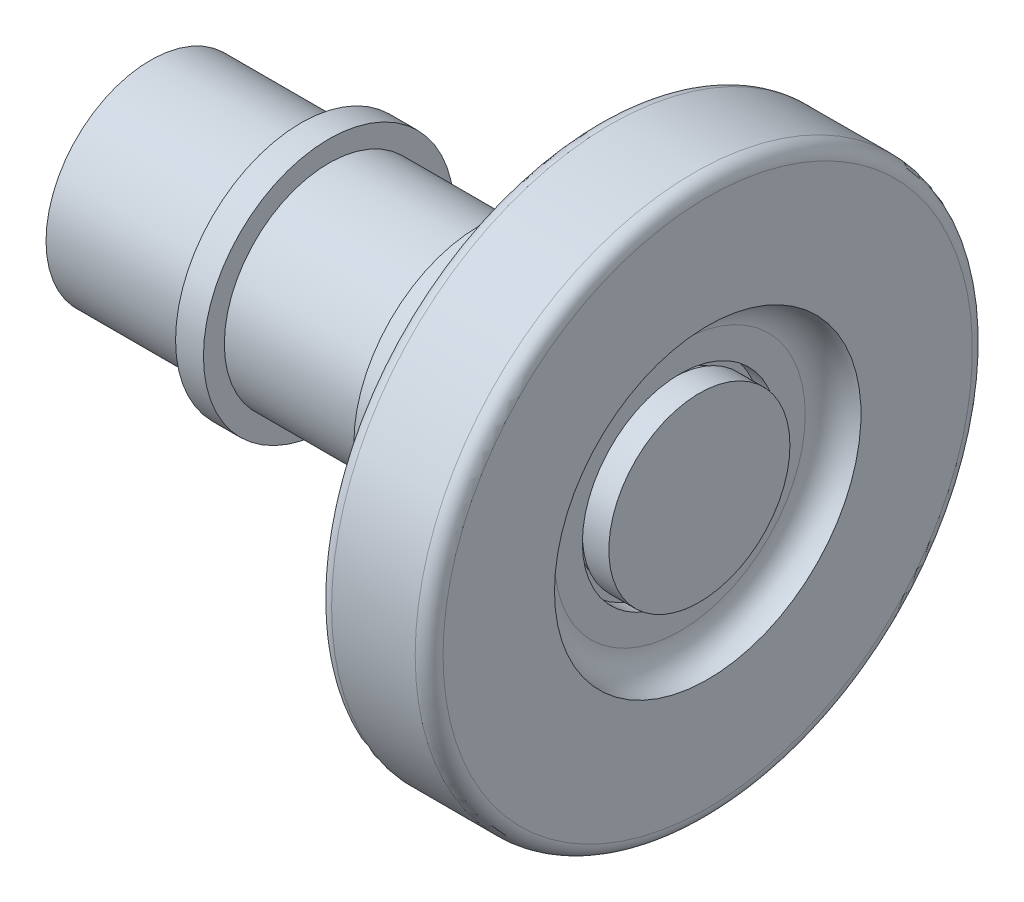
ISO-10303-21;
HEADER;
FILE_DESCRIPTION(('STEP AP214'),'2;1');
FILE_NAME('part.step','',(''),(''),'','','');
FILE_SCHEMA(('AUTOMOTIVE_DESIGN { 1 0 10303 214 1 1 1 1 }'));
ENDSEC;
DATA;
#1=APPLICATION_CONTEXT('core data for automotive mechanical design processes');
#2=APPLICATION_PROTOCOL_DEFINITION('international standard','automotive_design',2000,#1);
#3=PRODUCT_CONTEXT('',#1,'mechanical');
#4=PRODUCT('Part','Part','',(#3));
#5=PRODUCT_RELATED_PRODUCT_CATEGORY('part','',(#4));
#6=PRODUCT_DEFINITION_FORMATION('','',#4);
#7=PRODUCT_DEFINITION_CONTEXT('part definition',#1,'design');
#8=PRODUCT_DEFINITION('design','',#6,#7);
#9=PRODUCT_DEFINITION_SHAPE('','',#8);
#10=(LENGTH_UNIT() NAMED_UNIT(*) SI_UNIT(.MILLI.,.METRE.));
#11=(NAMED_UNIT(*) PLANE_ANGLE_UNIT() SI_UNIT($,.RADIAN.));
#12=(NAMED_UNIT(*) SI_UNIT($,.STERADIAN.) SOLID_ANGLE_UNIT());
#13=UNCERTAINTY_MEASURE_WITH_UNIT(LENGTH_MEASURE(1.E-05),#10,'distance_accuracy_value','');
#14=(GEOMETRIC_REPRESENTATION_CONTEXT(3) GLOBAL_UNCERTAINTY_ASSIGNED_CONTEXT((#13)) GLOBAL_UNIT_ASSIGNED_CONTEXT((#10,
#11,#12)) REPRESENTATION_CONTEXT('',''));
#15=CARTESIAN_POINT('',(0.,0.,0.));
#16=DIRECTION('',(0.,0.,1.));
#17=DIRECTION('',(1.,0.,0.));
#18=AXIS2_PLACEMENT_3D('',#15,#16,#17);
#19=CARTESIAN_POINT('',(34.,0.,0.));
#20=DIRECTION('',(-1.,0.,0.));
#21=DIRECTION('',(0.,0.,1.));
#22=AXIS2_PLACEMENT_3D('',#19,#20,#21);
#23=PLANE('',#22);
#24=CARTESIAN_POINT('',(34.,0.,0.));
#25=DIRECTION('',(-1.,0.,0.));
#26=DIRECTION('',(0.,0.,1.));
#27=AXIS2_PLACEMENT_3D('',#24,#25,#26);
#28=CIRCLE('',#27,35.);
#29=CARTESIAN_POINT('',(34.,0.,35.));
#30=VERTEX_POINT('',#29);
#31=EDGE_CURVE('E43',#30,#30,#28,.F.);
#32=ORIENTED_EDGE('',*,*,#31,.T.);
#33=EDGE_LOOP('',(#32));
#34=FACE_BOUND('',#33,.T.);
#35=CARTESIAN_POINT('',(34.,0.,0.));
#36=DIRECTION('',(-1.,0.,0.));
#37=DIRECTION('',(0.,0.,1.));
#38=AXIS2_PLACEMENT_3D('',#35,#36,#37);
#39=CIRCLE('',#38,31.);
#40=CARTESIAN_POINT('',(34.,0.,31.));
#41=VERTEX_POINT('',#40);
#42=EDGE_CURVE('E10',#41,#41,#39,.F.);
#43=ORIENTED_EDGE('',*,*,#42,.F.);
#44=EDGE_LOOP('',(#43));
#45=FACE_BOUND('',#44,.T.);
#46=ADVANCED_FACE('F32',(#34,#45),#23,.F.);
#47=CARTESIAN_POINT('',(-96.,0.,0.));
#48=DIRECTION('',(-1.,0.,0.));
#49=DIRECTION('',(0.,0.,1.));
#50=AXIS2_PLACEMENT_3D('',#47,#48,#49);
#51=PLANE('',#50);
#52=CARTESIAN_POINT('',(-96.,0.,0.));
#53=DIRECTION('',(-1.,0.,0.));
#54=DIRECTION('',(0.,0.,1.));
#55=AXIS2_PLACEMENT_3D('',#52,#53,#54);
#56=CIRCLE('',#55,45.);
#57=CARTESIAN_POINT('',(-96.,0.,45.));
#58=VERTEX_POINT('',#57);
#59=EDGE_CURVE('E86',#58,#58,#56,.T.);
#60=ORIENTED_EDGE('',*,*,#59,.T.);
#61=EDGE_LOOP('',(#60));
#62=FACE_BOUND('',#61,.T.);
#63=CARTESIAN_POINT('',(-96.,0.,0.));
#64=DIRECTION('',(-1.,0.,0.));
#65=DIRECTION('',(0.,0.,1.));
#66=AXIS2_PLACEMENT_3D('',#63,#64,#65);
#67=CIRCLE('',#66,37.5);
#68=CARTESIAN_POINT('',(-96.,0.,37.5));
#69=VERTEX_POINT('',#68);
#70=EDGE_CURVE('E95',#69,#69,#67,.T.);
#71=ORIENTED_EDGE('',*,*,#70,.F.);
#72=EDGE_LOOP('',(#71));
#73=FACE_BOUND('',#72,.T.);
#74=ADVANCED_FACE('F135',(#62,#73),#51,.T.);
#75=CARTESIAN_POINT('',(-32.,0.,0.));
#76=DIRECTION('',(-1.,0.,0.));
#77=DIRECTION('',(0.,0.,1.));
#78=AXIS2_PLACEMENT_3D('',#75,#76,#77);
#79=PLANE('',#78);
#80=CARTESIAN_POINT('',(-32.,0.,0.));
#81=DIRECTION('',(-1.,0.,0.));
#82=DIRECTION('',(0.,0.,1.));
#83=AXIS2_PLACEMENT_3D('',#80,#81,#82);
#84=CIRCLE('',#83,45.);
#85=CARTESIAN_POINT('',(-32.,0.,45.));
#86=VERTEX_POINT('',#85);
#87=EDGE_CURVE('E79',#86,#86,#84,.T.);
#88=ORIENTED_EDGE('',*,*,#87,.T.);
#89=EDGE_LOOP('',(#88));
#90=FACE_BOUND('',#89,.T.);
#91=CARTESIAN_POINT('',(-32.,0.,0.));
#92=DIRECTION('',(-1.,0.,0.));
#93=DIRECTION('',(0.,0.,1.));
#94=AXIS2_PLACEMENT_3D('',#91,#92,#93);
#95=CIRCLE('',#94,37.5);
#96=CARTESIAN_POINT('',(-32.,0.,37.5));
#97=VERTEX_POINT('',#96);
#98=EDGE_CURVE('E83',#97,#97,#95,.T.);
#99=ORIENTED_EDGE('',*,*,#98,.F.);
#100=EDGE_LOOP('',(#99));
#101=FACE_BOUND('',#100,.T.);
#102=ADVANCED_FACE('F141',(#90,#101),#79,.T.);
#103=CARTESIAN_POINT('',(0.,35.,0.));
#104=DIRECTION('',(1.,0.,0.));
#105=DIRECTION('',(0.,0.,-1.));
#106=AXIS2_PLACEMENT_3D('',#103,#104,#105);
#107=PLANE('',#106);
#108=CARTESIAN_POINT('',(0.,0.,0.));
#109=DIRECTION('',(-1.,0.,0.));
#110=DIRECTION('',(0.,0.,1.));
#111=AXIS2_PLACEMENT_3D('',#108,#109,#110);
#112=CIRCLE('',#111,70.);
#113=CARTESIAN_POINT('',(0.,0.,70.));
#114=VERTEX_POINT('',#113);
#115=EDGE_CURVE('E76',#114,#114,#112,.T.);
#116=ORIENTED_EDGE('',*,*,#115,.T.);
#117=EDGE_LOOP('',(#116));
#118=FACE_BOUND('',#117,.T.);
#119=CARTESIAN_POINT('',(0.,0.,0.));
#120=DIRECTION('',(1.,0.,0.));
#121=DIRECTION('',(0.,0.,-1.));
#122=AXIS2_PLACEMENT_3D('',#119,#120,#121);
#123=CIRCLE('',#122,45.);
#124=CARTESIAN_POINT('',(0.,0.,-45.));
#125=VERTEX_POINT('',#124);
#126=EDGE_CURVE('E39',#125,#125,#123,.F.);
#127=ORIENTED_EDGE('',*,*,#126,.F.);
#128=EDGE_LOOP('',(#127));
#129=FACE_BOUND('',#128,.T.);
#130=ADVANCED_FACE('F151',(#118,#129),#107,.F.);
#131=CARTESIAN_POINT('',(-1000.,0.,0.));
#132=DIRECTION('',(-1.,0.,0.));
#133=DIRECTION('',(0.,0.,1.));
#134=AXIS2_PLACEMENT_3D('',#131,#132,#133);
#135=CYLINDRICAL_SURFACE('',#134,35.);
#136=CARTESIAN_POINT('',(40.,0.,0.));
#137=DIRECTION('',(-1.,0.,0.));
#138=DIRECTION('',(0.,0.,1.));
#139=AXIS2_PLACEMENT_3D('',#136,#137,#138);
#140=CIRCLE('',#139,35.);
#141=CARTESIAN_POINT('',(40.,0.,35.));
#142=VERTEX_POINT('',#141);
#143=EDGE_CURVE('E73',#142,#142,#140,.T.);
#144=ORIENTED_EDGE('',*,*,#143,.F.);
#145=EDGE_LOOP('',(#144));
#146=FACE_BOUND('',#145,.T.);
#147=ORIENTED_EDGE('',*,*,#31,.F.);
#148=EDGE_LOOP('',(#147));
#149=FACE_BOUND('',#148,.T.);
#150=ADVANCED_FACE('F161',(#146,#149),#135,.F.);
#151=CARTESIAN_POINT('',(10.,70.,0.));
#152=DIRECTION('',(1.,0.,0.));
#153=DIRECTION('',(0.,0.,-1.));
#154=AXIS2_PLACEMENT_3D('',#151,#152,#153);
#155=PLANE('',#154);
#156=CARTESIAN_POINT('',(10.,0.,0.));
#157=DIRECTION('',(1.,0.,0.));
#158=DIRECTION('',(0.,0.,-1.));
#159=AXIS2_PLACEMENT_3D('',#156,#157,#158);
#160=CIRCLE('',#159,95.);
#161=CARTESIAN_POINT('',(10.,0.,-95.));
#162=VERTEX_POINT('',#161);
#163=EDGE_CURVE('E55',#162,#162,#160,.F.);
#164=ORIENTED_EDGE('',*,*,#163,.T.);
#165=EDGE_LOOP('',(#164));
#166=FACE_BOUND('',#165,.T.);
#167=CARTESIAN_POINT('',(10.,0.,0.));
#168=DIRECTION('',(1.,0.,0.));
#169=DIRECTION('',(0.,0.,-1.));
#170=AXIS2_PLACEMENT_3D('',#167,#168,#169);
#171=CIRCLE('',#170,75.);
#172=CARTESIAN_POINT('',(10.,0.,-75.));
#173=VERTEX_POINT('',#172);
#174=EDGE_CURVE('E58',#173,#173,#171,.T.);
#175=ORIENTED_EDGE('',*,*,#174,.T.);
#176=EDGE_LOOP('',(#175));
#177=FACE_BOUND('',#176,.T.);
#178=ADVANCED_FACE('F165',(#166,#177),#155,.F.);
#179=CARTESIAN_POINT('',(-1000.,0.,0.));
#180=DIRECTION('',(-1.,0.,0.));
#181=DIRECTION('',(0.,0.,1.));
#182=AXIS2_PLACEMENT_3D('',#179,#180,#181);
#183=CYLINDRICAL_SURFACE('',#182,100.);
#184=CARTESIAN_POINT('',(44.9999999999999,0.,0.));
#185=DIRECTION('',(-1.,0.,0.));
#186=DIRECTION('',(0.,0.,1.));
#187=AXIS2_PLACEMENT_3D('',#184,#185,#186);
#188=CIRCLE('',#187,100.);
#189=CARTESIAN_POINT('',(44.9999999999999,0.,100.));
#190=VERTEX_POINT('',#189);
#191=EDGE_CURVE('E64',#190,#190,#188,.T.);
#192=ORIENTED_EDGE('',*,*,#191,.T.);
#193=EDGE_LOOP('',(#192));
#194=FACE_BOUND('',#193,.T.);
#195=CARTESIAN_POINT('',(14.9999999999999,0.,0.));
#196=DIRECTION('',(1.,0.,0.));
#197=DIRECTION('',(0.,0.,-1.));
#198=AXIS2_PLACEMENT_3D('',#195,#196,#197);
#199=CIRCLE('',#198,100.);
#200=CARTESIAN_POINT('',(14.9999999999999,0.,-100.));
#201=VERTEX_POINT('',#200);
#202=EDGE_CURVE('E67',#201,#201,#199,.T.);
#203=ORIENTED_EDGE('',*,*,#202,.T.);
#204=EDGE_LOOP('',(#203));
#205=FACE_BOUND('',#204,.T.);
#206=ADVANCED_FACE('F173',(#194,#205),#183,.T.);
#207=CARTESIAN_POINT('',(50.,100.,0.));
#208=DIRECTION('',(-1.,0.,0.));
#209=DIRECTION('',(0.,0.,1.));
#210=AXIS2_PLACEMENT_3D('',#207,#208,#209);
#211=PLANE('',#210);
#212=CARTESIAN_POINT('',(50.,0.,0.));
#213=DIRECTION('',(-1.,0.,0.));
#214=DIRECTION('',(0.,0.,1.));
#215=AXIS2_PLACEMENT_3D('',#212,#213,#214);
#216=CIRCLE('',#215,95.);
#217=CARTESIAN_POINT('',(50.,0.,95.));
#218=VERTEX_POINT('',#217);
#219=EDGE_CURVE('E61',#218,#218,#216,.F.);
#220=ORIENTED_EDGE('',*,*,#219,.T.);
#221=EDGE_LOOP('',(#220));
#222=FACE_BOUND('',#221,.T.);
#223=CARTESIAN_POINT('',(50.,0.,0.));
#224=DIRECTION('',(-1.,0.,0.));
#225=DIRECTION('',(0.,0.,1.));
#226=AXIS2_PLACEMENT_3D('',#223,#224,#225);
#227=CIRCLE('',#226,55.);
#228=CARTESIAN_POINT('',(50.,0.,55.));
#229=VERTEX_POINT('',#228);
#230=EDGE_CURVE('E70',#229,#229,#227,.T.);
#231=ORIENTED_EDGE('',*,*,#230,.T.);
#232=EDGE_LOOP('',(#231));
#233=FACE_BOUND('',#232,.T.);
#234=ADVANCED_FACE('F169',(#222,#233),#211,.F.);
#235=CARTESIAN_POINT('',(40.,55.,0.));
#236=DIRECTION('',(-1.,0.,0.));
#237=DIRECTION('',(0.,0.,1.));
#238=AXIS2_PLACEMENT_3D('',#235,#236,#237);
#239=PLANE('',#238);
#240=CARTESIAN_POINT('',(40.,0.,0.));
#241=DIRECTION('',(-1.,0.,0.));
#242=DIRECTION('',(0.,0.,1.));
#243=AXIS2_PLACEMENT_3D('',#240,#241,#242);
#244=CIRCLE('',#243,45.);
#245=CARTESIAN_POINT('',(40.,0.,45.));
#246=VERTEX_POINT('',#245);
#247=EDGE_CURVE('E47',#246,#246,#244,.F.);
#248=ORIENTED_EDGE('',*,*,#247,.T.);
#249=EDGE_LOOP('',(#248));
#250=FACE_BOUND('',#249,.T.);
#251=ORIENTED_EDGE('',*,*,#143,.T.);
#252=EDGE_LOOP('',(#251));
#253=FACE_BOUND('',#252,.T.);
#254=ADVANCED_FACE('F157',(#250,#253),#239,.F.);
#255=CARTESIAN_POINT('',(-1000.,0.,0.));
#256=DIRECTION('',(-1.,0.,0.));
#257=DIRECTION('',(0.,0.,1.));
#258=AXIS2_PLACEMENT_3D('',#255,#256,#257);
#259=CYLINDRICAL_SURFACE('',#258,70.);
#260=CARTESIAN_POINT('',(4.99999999999989,0.,0.));
#261=DIRECTION('',(1.,0.,0.));
#262=DIRECTION('',(0.,0.,-1.));
#263=AXIS2_PLACEMENT_3D('',#260,#261,#262);
#264=CIRCLE('',#263,70.);
#265=CARTESIAN_POINT('',(4.99999999999989,0.,-70.));
#266=VERTEX_POINT('',#265);
#267=EDGE_CURVE('E52',#266,#266,#264,.F.);
#268=ORIENTED_EDGE('',*,*,#267,.T.);
#269=EDGE_LOOP('',(#268));
#270=FACE_BOUND('',#269,.T.);
#271=ORIENTED_EDGE('',*,*,#115,.F.);
#272=EDGE_LOOP('',(#271));
#273=FACE_BOUND('',#272,.T.);
#274=ADVANCED_FACE('F153',(#270,#273),#259,.T.);
#275=CARTESIAN_POINT('',(44.9999999999999,0.,0.));
#276=DIRECTION('',(-1.,0.,0.));
#277=DIRECTION('',(0.,0.,1.));
#278=AXIS2_PLACEMENT_3D('',#275,#276,#277);
#279=TOROIDAL_SURFACE('',#278,95.,5.);
#280=ORIENTED_EDGE('',*,*,#219,.F.);
#281=EDGE_LOOP('',(#280));
#282=FACE_BOUND('',#281,.T.);
#283=ORIENTED_EDGE('',*,*,#191,.F.);
#284=EDGE_LOOP('',(#283));
#285=FACE_BOUND('',#284,.T.);
#286=ADVANCED_FACE('F156',(#282,#285),#279,.T.);
#287=CARTESIAN_POINT('',(14.9999999999999,0.,0.));
#288=DIRECTION('',(1.,0.,0.));
#289=DIRECTION('',(0.,0.,-1.));
#290=AXIS2_PLACEMENT_3D('',#287,#288,#289);
#291=TOROIDAL_SURFACE('',#290,95.,5.);
#292=ORIENTED_EDGE('',*,*,#202,.F.);
#293=EDGE_LOOP('',(#292));
#294=FACE_BOUND('',#293,.T.);
#295=ORIENTED_EDGE('',*,*,#163,.F.);
#296=EDGE_LOOP('',(#295));
#297=FACE_BOUND('',#296,.T.);
#298=ADVANCED_FACE('F183',(#294,#297),#291,.T.);
#299=CARTESIAN_POINT('',(4.99999999999989,0.,0.));
#300=DIRECTION('',(1.,0.,0.));
#301=DIRECTION('',(0.,0.,-1.));
#302=AXIS2_PLACEMENT_3D('',#299,#300,#301);
#303=TOROIDAL_SURFACE('',#302,75.,5.);
#304=ORIENTED_EDGE('',*,*,#174,.F.);
#305=EDGE_LOOP('',(#304));
#306=FACE_BOUND('',#305,.T.);
#307=ORIENTED_EDGE('',*,*,#267,.F.);
#308=EDGE_LOOP('',(#307));
#309=FACE_BOUND('',#308,.T.);
#310=ADVANCED_FACE('F186',(#306,#309),#303,.F.);
#311=CARTESIAN_POINT('',(50.,0.,0.));
#312=DIRECTION('',(-1.,0.,0.));
#313=DIRECTION('',(0.,0.,1.));
#314=AXIS2_PLACEMENT_3D('',#311,#312,#313);
#315=TOROIDAL_SURFACE('',#314,45.,10.);
#316=ORIENTED_EDGE('',*,*,#247,.F.);
#317=EDGE_LOOP('',(#316));
#318=FACE_BOUND('',#317,.T.);
#319=ORIENTED_EDGE('',*,*,#230,.F.);
#320=EDGE_LOOP('',(#319));
#321=FACE_BOUND('',#320,.T.);
#322=ADVANCED_FACE('F34',(#318,#321),#315,.F.);
#323=CARTESIAN_POINT('',(-32.,0.,0.));
#324=DIRECTION('',(1.,0.,0.));
#325=DIRECTION('',(0.,0.,-1.));
#326=AXIS2_PLACEMENT_3D('',#323,#324,#325);
#327=CYLINDRICAL_SURFACE('',#326,45.);
#328=ORIENTED_EDGE('',*,*,#87,.F.);
#329=EDGE_LOOP('',(#328));
#330=FACE_BOUND('',#329,.T.);
#331=ORIENTED_EDGE('',*,*,#126,.T.);
#332=EDGE_LOOP('',(#331));
#333=FACE_BOUND('',#332,.T.);
#334=ADVANCED_FACE('F147',(#330,#333),#327,.T.);
#335=CARTESIAN_POINT('',(-86.,0.,0.));
#336=DIRECTION('',(1.,0.,0.));
#337=DIRECTION('',(0.,0.,-1.));
#338=AXIS2_PLACEMENT_3D('',#335,#336,#337);
#339=CYLINDRICAL_SURFACE('',#338,37.5);
#340=CARTESIAN_POINT('',(-86.,0.,0.));
#341=DIRECTION('',(-1.,0.,0.));
#342=DIRECTION('',(0.,0.,1.));
#343=AXIS2_PLACEMENT_3D('',#340,#341,#342);
#344=CIRCLE('',#343,37.5);
#345=CARTESIAN_POINT('',(-86.,0.,37.5));
#346=VERTEX_POINT('',#345);
#347=EDGE_CURVE('E82',#346,#346,#344,.T.);
#348=ORIENTED_EDGE('',*,*,#347,.F.);
#349=EDGE_LOOP('',(#348));
#350=FACE_BOUND('',#349,.T.);
#351=ORIENTED_EDGE('',*,*,#98,.T.);
#352=EDGE_LOOP('',(#351));
#353=FACE_BOUND('',#352,.T.);
#354=ADVANCED_FACE('F204',(#350,#353),#339,.T.);
#355=CARTESIAN_POINT('',(-86.,0.,0.));
#356=DIRECTION('',(-1.,0.,0.));
#357=DIRECTION('',(0.,0.,1.));
#358=AXIS2_PLACEMENT_3D('',#355,#356,#357);
#359=PLANE('',#358);
#360=CARTESIAN_POINT('',(-86.,0.,0.));
#361=DIRECTION('',(-1.,0.,0.));
#362=DIRECTION('',(0.,0.,1.));
#363=AXIS2_PLACEMENT_3D('',#360,#361,#362);
#364=CIRCLE('',#363,45.);
#365=CARTESIAN_POINT('',(-86.,0.,45.));
#366=VERTEX_POINT('',#365);
#367=EDGE_CURVE('E89',#366,#366,#364,.T.);
#368=ORIENTED_EDGE('',*,*,#367,.F.);
#369=EDGE_LOOP('',(#368));
#370=FACE_BOUND('',#369,.T.);
#371=ORIENTED_EDGE('',*,*,#347,.T.);
#372=EDGE_LOOP('',(#371));
#373=FACE_BOUND('',#372,.T.);
#374=ADVANCED_FACE('F217',(#370,#373),#359,.F.);
#375=CARTESIAN_POINT('',(-96.,0.,0.));
#376=DIRECTION('',(1.,0.,0.));
#377=DIRECTION('',(0.,0.,-1.));
#378=AXIS2_PLACEMENT_3D('',#375,#376,#377);
#379=CYLINDRICAL_SURFACE('',#378,45.);
#380=ORIENTED_EDGE('',*,*,#59,.F.);
#381=EDGE_LOOP('',(#380));
#382=FACE_BOUND('',#381,.T.);
#383=ORIENTED_EDGE('',*,*,#367,.T.);
#384=EDGE_LOOP('',(#383));
#385=FACE_BOUND('',#384,.T.);
#386=ADVANCED_FACE('F226',(#382,#385),#379,.T.);
#387=CARTESIAN_POINT('',(-150.,0.,0.));
#388=DIRECTION('',(1.,0.,0.));
#389=DIRECTION('',(0.,0.,-1.));
#390=AXIS2_PLACEMENT_3D('',#387,#388,#389);
#391=CYLINDRICAL_SURFACE('',#390,37.5);
#392=CARTESIAN_POINT('',(-150.,0.,0.));
#393=DIRECTION('',(-1.,0.,0.));
#394=DIRECTION('',(0.,0.,1.));
#395=AXIS2_PLACEMENT_3D('',#392,#393,#394);
#396=CIRCLE('',#395,37.5);
#397=CARTESIAN_POINT('',(-150.,0.,37.5));
#398=VERTEX_POINT('',#397);
#399=EDGE_CURVE('E92',#398,#398,#396,.T.);
#400=ORIENTED_EDGE('',*,*,#399,.F.);
#401=EDGE_LOOP('',(#400));
#402=FACE_BOUND('',#401,.T.);
#403=ORIENTED_EDGE('',*,*,#70,.T.);
#404=EDGE_LOOP('',(#403));
#405=FACE_BOUND('',#404,.T.);
#406=ADVANCED_FACE('F131',(#402,#405),#391,.T.);
#407=CARTESIAN_POINT('',(-150.,0.,0.));
#408=DIRECTION('',(-1.,0.,0.));
#409=DIRECTION('',(0.,0.,1.));
#410=AXIS2_PLACEMENT_3D('',#407,#408,#409);
#411=PLANE('',#410);
#412=ORIENTED_EDGE('',*,*,#399,.T.);
#413=EDGE_LOOP('',(#412));
#414=FACE_BOUND('',#413,.T.);
#415=ADVANCED_FACE('F126',(#414),#411,.T.);
#416=CARTESIAN_POINT('',(37.5,0.,0.));
#417=DIRECTION('',(-1.,0.,0.));
#418=DIRECTION('',(0.,0.,1.));
#419=AXIS2_PLACEMENT_3D('',#416,#417,#418);
#420=CYLINDRICAL_SURFACE('',#419,31.);
#421=CARTESIAN_POINT('',(37.5,0.,0.));
#422=DIRECTION('',(1.,0.,0.));
#423=DIRECTION('',(0.,0.,-1.));
#424=AXIS2_PLACEMENT_3D('',#421,#422,#423);
#425=CIRCLE('',#424,31.);
#426=CARTESIAN_POINT('',(37.5,0.,-31.));
#427=VERTEX_POINT('',#426);
#428=EDGE_CURVE('E98',#427,#427,#425,.T.);
#429=ORIENTED_EDGE('',*,*,#428,.F.);
#430=EDGE_LOOP('',(#429));
#431=FACE_BOUND('',#430,.T.);
#432=ORIENTED_EDGE('',*,*,#42,.T.);
#433=EDGE_LOOP('',(#432));
#434=FACE_BOUND('',#433,.T.);
#435=ADVANCED_FACE('F121',(#431,#434),#420,.T.);
#436=CARTESIAN_POINT('',(37.5,0.,0.));
#437=DIRECTION('',(1.,0.,0.));
#438=DIRECTION('',(0.,0.,-1.));
#439=AXIS2_PLACEMENT_3D('',#436,#437,#438);
#440=PLANE('',#439);
#441=CARTESIAN_POINT('',(37.5,0.,0.));
#442=DIRECTION('',(1.,0.,0.));
#443=DIRECTION('',(0.,0.,-1.));
#444=AXIS2_PLACEMENT_3D('',#441,#442,#443);
#445=CIRCLE('',#444,32.5);
#446=CARTESIAN_POINT('',(37.5,0.,-32.5));
#447=VERTEX_POINT('',#446);
#448=EDGE_CURVE('E104',#447,#447,#445,.T.);
#449=ORIENTED_EDGE('',*,*,#448,.F.);
#450=EDGE_LOOP('',(#449));
#451=FACE_BOUND('',#450,.T.);
#452=ORIENTED_EDGE('',*,*,#428,.T.);
#453=EDGE_LOOP('',(#452));
#454=FACE_BOUND('',#453,.T.);
#455=ADVANCED_FACE('F115',(#451,#454),#440,.F.);
#456=CARTESIAN_POINT('',(47.,0.,0.));
#457=DIRECTION('',(-1.,0.,0.));
#458=DIRECTION('',(0.,0.,1.));
#459=AXIS2_PLACEMENT_3D('',#456,#457,#458);
#460=CYLINDRICAL_SURFACE('',#459,32.5);
#461=CARTESIAN_POINT('',(47.,0.,0.));
#462=DIRECTION('',(1.,0.,0.));
#463=DIRECTION('',(0.,0.,-1.));
#464=AXIS2_PLACEMENT_3D('',#461,#462,#463);
#465=CIRCLE('',#464,32.5);
#466=CARTESIAN_POINT('',(47.,0.,-32.5));
#467=VERTEX_POINT('',#466);
#468=EDGE_CURVE('E103',#467,#467,#465,.T.);
#469=ORIENTED_EDGE('',*,*,#468,.F.);
#470=EDGE_LOOP('',(#469));
#471=FACE_BOUND('',#470,.T.);
#472=ORIENTED_EDGE('',*,*,#448,.T.);
#473=EDGE_LOOP('',(#472));
#474=FACE_BOUND('',#473,.T.);
#475=ADVANCED_FACE('F112',(#471,#474),#460,.T.);
#476=CARTESIAN_POINT('',(47.,0.,0.));
#477=DIRECTION('',(1.,0.,0.));
#478=DIRECTION('',(0.,0.,-1.));
#479=AXIS2_PLACEMENT_3D('',#476,#477,#478);
#480=PLANE('',#479);
#481=ORIENTED_EDGE('',*,*,#468,.T.);
#482=EDGE_LOOP('',(#481));
#483=FACE_BOUND('',#482,.T.);
#484=ADVANCED_FACE('F110',(#483),#480,.T.);
#485=CLOSED_SHELL('',(#46,#74,#102,#130,#150,#178,#206,#234,#254,#274,#286,#298,#310,#322,#334,
#354,#374,#386,#406,#415,#435,#455,#475,#484));
#486=MANIFOLD_SOLID_BREP('B2',#485);
#487=ADVANCED_BREP_SHAPE_REPRESENTATION('',(#18,#486),#14);
#488=SHAPE_DEFINITION_REPRESENTATION(#9,#487);
ENDSEC;
END-ISO-10303-21;
